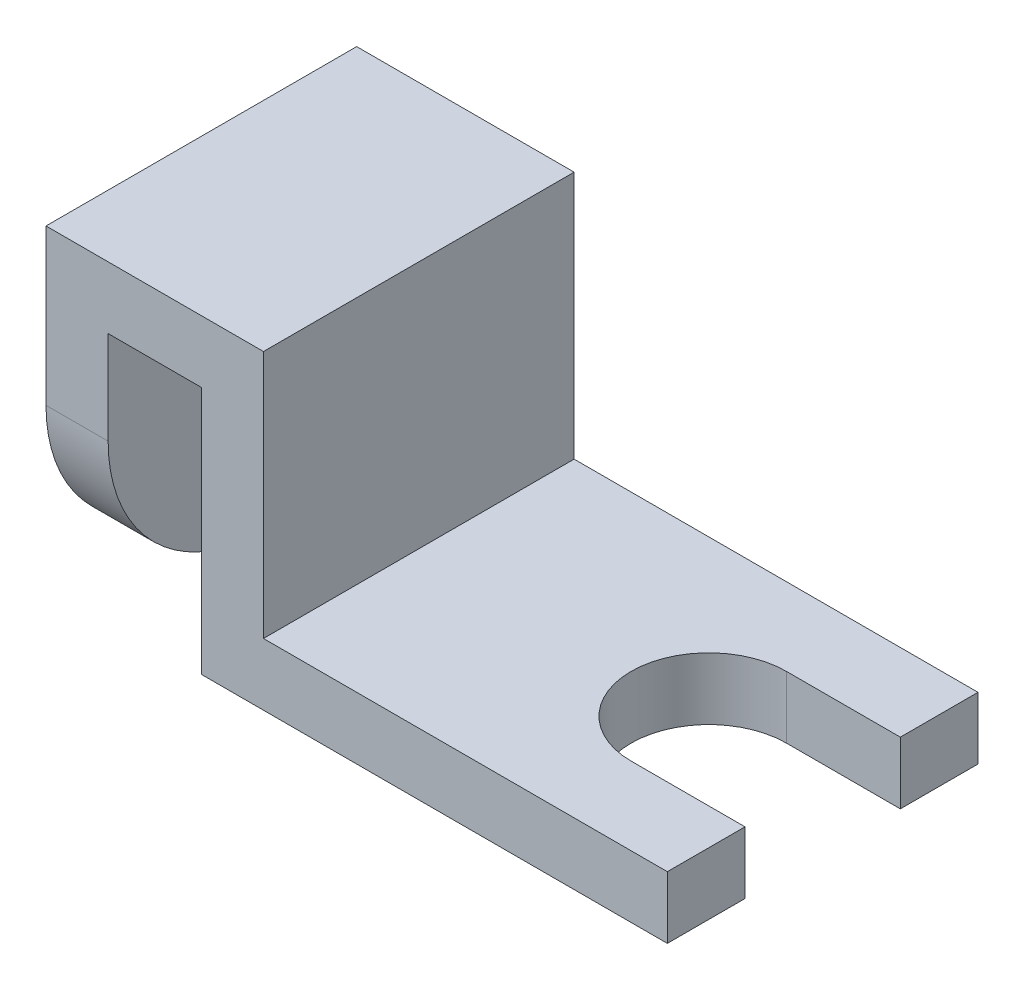
ISO-10303-21;
HEADER;
FILE_DESCRIPTION(('STEP AP214'),'2;1');
FILE_NAME('part.step','',(''),(''),'','','');
FILE_SCHEMA(('AUTOMOTIVE_DESIGN { 1 0 10303 214 1 1 1 1 }'));
ENDSEC;
DATA;
#1=APPLICATION_CONTEXT('core data for automotive mechanical design processes');
#2=APPLICATION_PROTOCOL_DEFINITION('international standard','automotive_design',2000,#1);
#3=PRODUCT_CONTEXT('',#1,'mechanical');
#4=PRODUCT('Part','Part','',(#3));
#5=PRODUCT_RELATED_PRODUCT_CATEGORY('part','',(#4));
#6=PRODUCT_DEFINITION_FORMATION('','',#4);
#7=PRODUCT_DEFINITION_CONTEXT('part definition',#1,'design');
#8=PRODUCT_DEFINITION('design','',#6,#7);
#9=PRODUCT_DEFINITION_SHAPE('','',#8);
#10=(LENGTH_UNIT() NAMED_UNIT(*) SI_UNIT(.MILLI.,.METRE.));
#11=(NAMED_UNIT(*) PLANE_ANGLE_UNIT() SI_UNIT($,.RADIAN.));
#12=(NAMED_UNIT(*) SI_UNIT($,.STERADIAN.) SOLID_ANGLE_UNIT());
#13=UNCERTAINTY_MEASURE_WITH_UNIT(LENGTH_MEASURE(1.E-05),#10,'distance_accuracy_value','');
#14=(GEOMETRIC_REPRESENTATION_CONTEXT(3) GLOBAL_UNCERTAINTY_ASSIGNED_CONTEXT((#13)) GLOBAL_UNIT_ASSIGNED_CONTEXT((#10,
#11,#12)) REPRESENTATION_CONTEXT('',''));
#15=CARTESIAN_POINT('',(0.,0.,0.));
#16=DIRECTION('',(0.,0.,1.));
#17=DIRECTION('',(1.,0.,0.));
#18=AXIS2_PLACEMENT_3D('',#15,#16,#17);
#19=CARTESIAN_POINT('',(0.,-3.,30.));
#20=DIRECTION('',(0.,1.,0.));
#21=DIRECTION('',(0.,0.,1.));
#22=AXIS2_PLACEMENT_3D('',#19,#20,#21);
#23=PLANE('',#22);
#24=DIRECTION('',(1.,0.,0.));
#25=VECTOR('',#24,1.);
#26=CARTESIAN_POINT('',(0.,-3.,7.50000000000001));
#27=LINE('',#26,#25);
#28=CARTESIAN_POINT('',(11.5,-3.,7.50000000000001));
#29=VERTEX_POINT('',#28);
#30=CARTESIAN_POINT('',(22.5,-3.,7.50000000000001));
#31=VERTEX_POINT('',#30);
#32=EDGE_CURVE('E157',#29,#31,#27,.T.);
#33=ORIENTED_EDGE('',*,*,#32,.F.);
#34=CARTESIAN_POINT('',(11.5,-3.,15.));
#35=DIRECTION('',(0.,1.,0.));
#36=DIRECTION('',(0.,0.,1.));
#37=AXIS2_PLACEMENT_3D('',#34,#35,#36);
#38=CIRCLE('',#37,7.5);
#39=CARTESIAN_POINT('',(11.5,-3.,22.5));
#40=VERTEX_POINT('',#39);
#41=EDGE_CURVE('E167',#29,#40,#38,.T.);
#42=ORIENTED_EDGE('',*,*,#41,.T.);
#43=DIRECTION('',(-1.,0.,0.));
#44=VECTOR('',#43,1.);
#45=CARTESIAN_POINT('',(0.,-3.,22.5));
#46=LINE('',#45,#44);
#47=CARTESIAN_POINT('',(22.5,-3.,22.5));
#48=VERTEX_POINT('',#47);
#49=EDGE_CURVE('E163',#48,#40,#46,.T.);
#50=ORIENTED_EDGE('',*,*,#49,.F.);
#51=DIRECTION('',(0.,0.,-1.));
#52=VECTOR('',#51,1.);
#53=CARTESIAN_POINT('',(22.5,-3.,30.));
#54=LINE('',#53,#52);
#55=CARTESIAN_POINT('',(22.5,-3.,30.));
#56=VERTEX_POINT('',#55);
#57=EDGE_CURVE('E254',#56,#48,#54,.T.);
#58=ORIENTED_EDGE('',*,*,#57,.F.);
#59=DIRECTION('',(1.,0.,0.));
#60=VECTOR('',#59,1.);
#61=CARTESIAN_POINT('',(0.,-3.,30.));
#62=LINE('',#61,#60);
#63=CARTESIAN_POINT('',(-22.5,-3.,30.));
#64=VERTEX_POINT('',#63);
#65=EDGE_CURVE('E206',#64,#56,#62,.T.);
#66=ORIENTED_EDGE('',*,*,#65,.F.);
#67=DIRECTION('',(0.,0.,-1.));
#68=VECTOR('',#67,1.);
#69=CARTESIAN_POINT('',(-22.5,-3.,30.));
#70=LINE('',#69,#68);
#71=CARTESIAN_POINT('',(-22.5,-3.,0.));
#72=VERTEX_POINT('',#71);
#73=EDGE_CURVE('E257',#64,#72,#70,.T.);
#74=ORIENTED_EDGE('',*,*,#73,.T.);
#75=DIRECTION('',(1.,0.,0.));
#76=VECTOR('',#75,1.);
#77=CARTESIAN_POINT('',(0.,-3.,0.));
#78=LINE('',#77,#76);
#79=CARTESIAN_POINT('',(22.5,-3.,0.));
#80=VERTEX_POINT('',#79);
#81=EDGE_CURVE('E229',#72,#80,#78,.T.);
#82=ORIENTED_EDGE('',*,*,#81,.T.);
#83=EDGE_CURVE('E174',#31,#80,#54,.T.);
#84=ORIENTED_EDGE('',*,*,#83,.F.);
#85=EDGE_LOOP('',(#33,#42,#50,#58,#66,#74,#82,#84));
#86=FACE_BOUND('',#85,.T.);
#87=ADVANCED_FACE('F48',(#86),#23,.F.);
#88=CARTESIAN_POINT('',(22.5,0.,30.));
#89=DIRECTION('',(-1.,0.,0.));
#90=DIRECTION('',(0.,0.,1.));
#91=AXIS2_PLACEMENT_3D('',#88,#89,#90);
#92=PLANE('',#91);
#93=DIRECTION('',(0.,1.,0.));
#94=VECTOR('',#93,1.);
#95=CARTESIAN_POINT('',(22.5,-3.,7.50000000000001));
#96=LINE('',#95,#94);
#97=CARTESIAN_POINT('',(22.5,3.,7.50000000000001));
#98=VERTEX_POINT('',#97);
#99=EDGE_CURVE('E184',#31,#98,#96,.T.);
#100=ORIENTED_EDGE('',*,*,#99,.F.);
#101=ORIENTED_EDGE('',*,*,#83,.T.);
#102=DIRECTION('',(0.,1.,0.));
#103=VECTOR('',#102,1.);
#104=CARTESIAN_POINT('',(22.5,0.,0.));
#105=LINE('',#104,#103);
#106=CARTESIAN_POINT('',(22.5,3.,0.));
#107=VERTEX_POINT('',#106);
#108=EDGE_CURVE('E231',#80,#107,#105,.T.);
#109=ORIENTED_EDGE('',*,*,#108,.T.);
#110=DIRECTION('',(0.,0.,-1.));
#111=VECTOR('',#110,1.);
#112=CARTESIAN_POINT('',(22.5,3.,30.));
#113=LINE('',#112,#111);
#114=EDGE_CURVE('E250',#98,#107,#113,.T.);
#115=ORIENTED_EDGE('',*,*,#114,.F.);
#116=EDGE_LOOP('',(#100,#101,#109,#115));
#117=FACE_BOUND('',#116,.T.);
#118=ADVANCED_FACE('F314',(#117),#92,.F.);
#119=DIRECTION('',(0.,1.,0.));
#120=VECTOR('',#119,1.);
#121=CARTESIAN_POINT('',(22.5,-3.,22.5));
#122=LINE('',#121,#120);
#123=CARTESIAN_POINT('',(22.5,3.,22.5));
#124=VERTEX_POINT('',#123);
#125=EDGE_CURVE('E187',#48,#124,#122,.T.);
#126=ORIENTED_EDGE('',*,*,#125,.T.);
#127=CARTESIAN_POINT('',(22.5,3.,30.));
#128=VERTEX_POINT('',#127);
#129=EDGE_CURVE('E251',#128,#124,#113,.T.);
#130=ORIENTED_EDGE('',*,*,#129,.F.);
#131=DIRECTION('',(0.,1.,0.));
#132=VECTOR('',#131,1.);
#133=CARTESIAN_POINT('',(22.5,0.,30.));
#134=LINE('',#133,#132);
#135=EDGE_CURVE('E208',#56,#128,#134,.T.);
#136=ORIENTED_EDGE('',*,*,#135,.F.);
#137=ORIENTED_EDGE('',*,*,#57,.T.);
#138=EDGE_LOOP('',(#126,#130,#136,#137));
#139=FACE_BOUND('',#138,.T.);
#140=ADVANCED_FACE('F322',(#139),#92,.F.);
#141=CARTESIAN_POINT('',(0.,3.,30.));
#142=DIRECTION('',(0.,1.,0.));
#143=DIRECTION('',(0.,0.,1.));
#144=AXIS2_PLACEMENT_3D('',#141,#142,#143);
#145=PLANE('',#144);
#146=CARTESIAN_POINT('',(11.5,3.,15.));
#147=DIRECTION('',(0.,1.,0.));
#148=DIRECTION('',(0.,0.,1.));
#149=AXIS2_PLACEMENT_3D('',#146,#147,#148);
#150=CIRCLE('',#149,7.5);
#151=CARTESIAN_POINT('',(11.5,3.,7.50000000000001));
#152=VERTEX_POINT('',#151);
#153=CARTESIAN_POINT('',(11.5,3.,22.5));
#154=VERTEX_POINT('',#153);
#155=EDGE_CURVE('E178',#152,#154,#150,.T.);
#156=ORIENTED_EDGE('',*,*,#155,.F.);
#157=DIRECTION('',(1.,0.,0.));
#158=VECTOR('',#157,1.);
#159=CARTESIAN_POINT('',(0.,3.,7.50000000000001));
#160=LINE('',#159,#158);
#161=EDGE_CURVE('E64',#152,#98,#160,.T.);
#162=ORIENTED_EDGE('',*,*,#161,.T.);
#163=ORIENTED_EDGE('',*,*,#114,.T.);
#164=DIRECTION('',(1.,0.,0.));
#165=VECTOR('',#164,1.);
#166=CARTESIAN_POINT('',(0.,3.,0.));
#167=LINE('',#166,#165);
#168=CARTESIAN_POINT('',(-16.5,3.,0.));
#169=VERTEX_POINT('',#168);
#170=EDGE_CURVE('E234',#169,#107,#167,.T.);
#171=ORIENTED_EDGE('',*,*,#170,.F.);
#172=DIRECTION('',(0.,0.,-1.));
#173=VECTOR('',#172,1.);
#174=CARTESIAN_POINT('',(-16.5,3.,30.));
#175=LINE('',#174,#173);
#176=CARTESIAN_POINT('',(-16.5,3.,30.));
#177=VERTEX_POINT('',#176);
#178=EDGE_CURVE('E248',#177,#169,#175,.T.);
#179=ORIENTED_EDGE('',*,*,#178,.F.);
#180=DIRECTION('',(1.,0.,0.));
#181=VECTOR('',#180,1.);
#182=CARTESIAN_POINT('',(0.,3.,30.));
#183=LINE('',#182,#181);
#184=EDGE_CURVE('E210',#177,#128,#183,.T.);
#185=ORIENTED_EDGE('',*,*,#184,.T.);
#186=ORIENTED_EDGE('',*,*,#129,.T.);
#187=DIRECTION('',(-1.,0.,0.));
#188=VECTOR('',#187,1.);
#189=CARTESIAN_POINT('',(0.,3.,22.5));
#190=LINE('',#189,#188);
#191=EDGE_CURVE('E175',#124,#154,#190,.T.);
#192=ORIENTED_EDGE('',*,*,#191,.T.);
#193=EDGE_LOOP('',(#156,#162,#163,#171,#179,#185,#186,#192));
#194=FACE_BOUND('',#193,.T.);
#195=ADVANCED_FACE('F310',(#194),#145,.T.);
#196=CARTESIAN_POINT('',(-31.5,0.,30.));
#197=DIRECTION('',(1.,0.,0.));
#198=DIRECTION('',(0.,0.,-1.));
#199=AXIS2_PLACEMENT_3D('',#196,#197,#198);
#200=PLANE('',#199);
#201=CARTESIAN_POINT('',(-31.5,12.,15.));
#202=DIRECTION('',(1.,0.,0.));
#203=DIRECTION('',(0.,0.,-1.));
#204=AXIS2_PLACEMENT_3D('',#201,#202,#203);
#205=CIRCLE('',#204,6.);
#206=CARTESIAN_POINT('',(-31.5,12.,9.00000000000001));
#207=VERTEX_POINT('',#206);
#208=EDGE_CURVE('E186',#207,#207,#205,.F.);
#209=ORIENTED_EDGE('',*,*,#208,.T.);
#210=EDGE_LOOP('',(#209));
#211=FACE_BOUND('',#210,.T.);
#212=CARTESIAN_POINT('',(-31.5,12.,15.));
#213=DIRECTION('',(1.,0.,0.));
#214=DIRECTION('',(0.,0.,-1.));
#215=AXIS2_PLACEMENT_3D('',#212,#213,#214);
#216=CIRCLE('',#215,15.);
#217=CARTESIAN_POINT('',(-31.5,12.,30.));
#218=VERTEX_POINT('',#217);
#219=CARTESIAN_POINT('',(-31.5,-3.,15.));
#220=VERTEX_POINT('',#219);
#221=EDGE_CURVE('E263',#218,#220,#216,.T.);
#222=ORIENTED_EDGE('',*,*,#221,.T.);
#223=CARTESIAN_POINT('',(-31.5,12.,15.));
#224=DIRECTION('',(1.,0.,0.));
#225=DIRECTION('',(0.,0.,-1.));
#226=AXIS2_PLACEMENT_3D('',#223,#224,#225);
#227=CIRCLE('',#226,15.);
#228=CARTESIAN_POINT('',(-31.5,12.,0.));
#229=VERTEX_POINT('',#228);
#230=EDGE_CURVE('E265',#220,#229,#227,.T.);
#231=ORIENTED_EDGE('',*,*,#230,.T.);
#232=DIRECTION('',(0.,-1.,0.));
#233=VECTOR('',#232,1.);
#234=CARTESIAN_POINT('',(-31.5,0.,0.));
#235=LINE('',#234,#233);
#236=CARTESIAN_POINT('',(-31.5,21.,0.));
#237=VERTEX_POINT('',#236);
#238=EDGE_CURVE('E220',#237,#229,#235,.T.);
#239=ORIENTED_EDGE('',*,*,#238,.F.);
#240=DIRECTION('',(0.,0.,-1.));
#241=VECTOR('',#240,1.);
#242=CARTESIAN_POINT('',(-31.5,21.,30.));
#243=LINE('',#242,#241);
#244=CARTESIAN_POINT('',(-31.5,21.,30.));
#245=VERTEX_POINT('',#244);
#246=EDGE_CURVE('E261',#245,#237,#243,.T.);
#247=ORIENTED_EDGE('',*,*,#246,.F.);
#248=DIRECTION('',(0.,-1.,0.));
#249=VECTOR('',#248,1.);
#250=CARTESIAN_POINT('',(-31.5,0.,30.));
#251=LINE('',#250,#249);
#252=EDGE_CURVE('E196',#245,#218,#251,.T.);
#253=ORIENTED_EDGE('',*,*,#252,.T.);
#254=EDGE_LOOP('',(#222,#231,#239,#247,#253));
#255=FACE_BOUND('',#254,.T.);
#256=ADVANCED_FACE('F284',(#211,#255),#200,.T.);
#257=CARTESIAN_POINT('',(0.,21.,30.));
#258=DIRECTION('',(0.,-1.,0.));
#259=DIRECTION('',(0.,0.,-1.));
#260=AXIS2_PLACEMENT_3D('',#257,#258,#259);
#261=PLANE('',#260);
#262=DIRECTION('',(-1.,0.,0.));
#263=VECTOR('',#262,1.);
#264=CARTESIAN_POINT('',(0.,21.,0.));
#265=LINE('',#264,#263);
#266=CARTESIAN_POINT('',(-22.5,21.,0.));
#267=VERTEX_POINT('',#266);
#268=EDGE_CURVE('E223',#267,#237,#265,.T.);
#269=ORIENTED_EDGE('',*,*,#268,.F.);
#270=DIRECTION('',(0.,0.,-1.));
#271=VECTOR('',#270,1.);
#272=CARTESIAN_POINT('',(-22.5,21.,30.));
#273=LINE('',#272,#271);
#274=CARTESIAN_POINT('',(-22.5,21.,30.));
#275=VERTEX_POINT('',#274);
#276=EDGE_CURVE('E259',#275,#267,#273,.T.);
#277=ORIENTED_EDGE('',*,*,#276,.F.);
#278=DIRECTION('',(-1.,0.,0.));
#279=VECTOR('',#278,1.);
#280=CARTESIAN_POINT('',(0.,21.,30.));
#281=LINE('',#280,#279);
#282=EDGE_CURVE('E199',#275,#245,#281,.T.);
#283=ORIENTED_EDGE('',*,*,#282,.T.);
#284=ORIENTED_EDGE('',*,*,#246,.T.);
#285=EDGE_LOOP('',(#269,#277,#283,#284));
#286=FACE_BOUND('',#285,.T.);
#287=ADVANCED_FACE('F291',(#286),#261,.T.);
#288=CARTESIAN_POINT('',(-22.5,0.,30.));
#289=DIRECTION('',(-1.,0.,0.));
#290=DIRECTION('',(0.,0.,1.));
#291=AXIS2_PLACEMENT_3D('',#288,#289,#290);
#292=PLANE('',#291);
#293=DIRECTION('',(0.,1.,0.));
#294=VECTOR('',#293,1.);
#295=CARTESIAN_POINT('',(-22.5,0.,0.));
#296=LINE('',#295,#294);
#297=EDGE_CURVE('E226',#72,#267,#296,.T.);
#298=ORIENTED_EDGE('',*,*,#297,.F.);
#299=ORIENTED_EDGE('',*,*,#73,.F.);
#300=DIRECTION('',(0.,1.,0.));
#301=VECTOR('',#300,1.);
#302=CARTESIAN_POINT('',(-22.5,0.,30.));
#303=LINE('',#302,#301);
#304=EDGE_CURVE('E203',#64,#275,#303,.T.);
#305=ORIENTED_EDGE('',*,*,#304,.T.);
#306=ORIENTED_EDGE('',*,*,#276,.T.);
#307=EDGE_LOOP('',(#298,#299,#305,#306));
#308=FACE_BOUND('',#307,.T.);
#309=ADVANCED_FACE('F318',(#308),#292,.T.);
#310=CARTESIAN_POINT('',(-16.5,0.,30.));
#311=DIRECTION('',(-1.,0.,0.));
#312=DIRECTION('',(0.,0.,1.));
#313=AXIS2_PLACEMENT_3D('',#310,#311,#312);
#314=PLANE('',#313);
#315=DIRECTION('',(0.,1.,0.));
#316=VECTOR('',#315,1.);
#317=CARTESIAN_POINT('',(-16.5,0.,0.));
#318=LINE('',#317,#316);
#319=CARTESIAN_POINT('',(-16.5,27.,0.));
#320=VERTEX_POINT('',#319);
#321=EDGE_CURVE('E237',#169,#320,#318,.T.);
#322=ORIENTED_EDGE('',*,*,#321,.T.);
#323=DIRECTION('',(0.,0.,-1.));
#324=VECTOR('',#323,1.);
#325=CARTESIAN_POINT('',(-16.5,27.,30.));
#326=LINE('',#325,#324);
#327=CARTESIAN_POINT('',(-16.5,27.,30.));
#328=VERTEX_POINT('',#327);
#329=EDGE_CURVE('E245',#328,#320,#326,.T.);
#330=ORIENTED_EDGE('',*,*,#329,.F.);
#331=DIRECTION('',(0.,1.,0.));
#332=VECTOR('',#331,1.);
#333=CARTESIAN_POINT('',(-16.5,0.,30.));
#334=LINE('',#333,#332);
#335=EDGE_CURVE('E213',#177,#328,#334,.T.);
#336=ORIENTED_EDGE('',*,*,#335,.F.);
#337=ORIENTED_EDGE('',*,*,#178,.T.);
#338=EDGE_LOOP('',(#322,#330,#336,#337));
#339=FACE_BOUND('',#338,.T.);
#340=ADVANCED_FACE('F307',(#339),#314,.F.);
#341=CARTESIAN_POINT('',(0.,27.,30.));
#342=DIRECTION('',(0.,-1.,0.));
#343=DIRECTION('',(1.,0.,0.));
#344=AXIS2_PLACEMENT_3D('',#341,#342,#343);
#345=PLANE('',#344);
#346=DIRECTION('',(-1.,0.,0.));
#347=VECTOR('',#346,1.);
#348=CARTESIAN_POINT('',(0.,27.,0.));
#349=LINE('',#348,#347);
#350=CARTESIAN_POINT('',(-37.5,27.,0.));
#351=VERTEX_POINT('',#350);
#352=EDGE_CURVE('E239',#320,#351,#349,.T.);
#353=ORIENTED_EDGE('',*,*,#352,.T.);
#354=DIRECTION('',(0.,0.,-1.));
#355=VECTOR('',#354,1.);
#356=CARTESIAN_POINT('',(-37.5,27.,30.));
#357=LINE('',#356,#355);
#358=CARTESIAN_POINT('',(-37.5,27.,30.));
#359=VERTEX_POINT('',#358);
#360=EDGE_CURVE('E219',#359,#351,#357,.T.);
#361=ORIENTED_EDGE('',*,*,#360,.F.);
#362=DIRECTION('',(-1.,0.,0.));
#363=VECTOR('',#362,1.);
#364=CARTESIAN_POINT('',(0.,27.,30.));
#365=LINE('',#364,#363);
#366=EDGE_CURVE('E215',#328,#359,#365,.T.);
#367=ORIENTED_EDGE('',*,*,#366,.F.);
#368=ORIENTED_EDGE('',*,*,#329,.T.);
#369=EDGE_LOOP('',(#353,#361,#367,#368));
#370=FACE_BOUND('',#369,.T.);
#371=ADVANCED_FACE('F303',(#370),#345,.F.);
#372=CARTESIAN_POINT('',(-37.5,0.,30.));
#373=DIRECTION('',(1.,0.,0.));
#374=DIRECTION('',(0.,0.,-1.));
#375=AXIS2_PLACEMENT_3D('',#372,#373,#374);
#376=PLANE('',#375);
#377=CARTESIAN_POINT('',(-37.5,12.,15.));
#378=DIRECTION('',(-1.,0.,0.));
#379=DIRECTION('',(0.,0.,1.));
#380=AXIS2_PLACEMENT_3D('',#377,#378,#379);
#381=CIRCLE('',#380,6.);
#382=CARTESIAN_POINT('',(-37.5,12.,21.));
#383=VERTEX_POINT('',#382);
#384=EDGE_CURVE('E193',#383,#383,#381,.T.);
#385=ORIENTED_EDGE('',*,*,#384,.F.);
#386=EDGE_LOOP('',(#385));
#387=FACE_BOUND('',#386,.T.);
#388=DIRECTION('',(0.,-1.,0.));
#389=VECTOR('',#388,1.);
#390=CARTESIAN_POINT('',(-37.5,0.,0.));
#391=LINE('',#390,#389);
#392=CARTESIAN_POINT('',(-37.5,12.,0.));
#393=VERTEX_POINT('',#392);
#394=EDGE_CURVE('E200',#351,#393,#391,.T.);
#395=ORIENTED_EDGE('',*,*,#394,.T.);
#396=CARTESIAN_POINT('',(-37.5,12.,15.));
#397=DIRECTION('',(1.,0.,0.));
#398=DIRECTION('',(0.,0.,-1.));
#399=AXIS2_PLACEMENT_3D('',#396,#397,#398);
#400=CIRCLE('',#399,15.);
#401=CARTESIAN_POINT('',(-37.5,-3.,15.));
#402=VERTEX_POINT('',#401);
#403=EDGE_CURVE('E57',#393,#402,#400,.F.);
#404=ORIENTED_EDGE('',*,*,#403,.T.);
#405=CARTESIAN_POINT('',(-37.5,12.,15.));
#406=DIRECTION('',(1.,0.,0.));
#407=DIRECTION('',(0.,0.,-1.));
#408=AXIS2_PLACEMENT_3D('',#405,#406,#407);
#409=CIRCLE('',#408,15.);
#410=CARTESIAN_POINT('',(-37.5,12.,30.));
#411=VERTEX_POINT('',#410);
#412=EDGE_CURVE('E72',#402,#411,#409,.F.);
#413=ORIENTED_EDGE('',*,*,#412,.T.);
#414=DIRECTION('',(0.,-1.,0.));
#415=VECTOR('',#414,1.);
#416=CARTESIAN_POINT('',(-37.5,0.,30.));
#417=LINE('',#416,#415);
#418=EDGE_CURVE('E217',#359,#411,#417,.T.);
#419=ORIENTED_EDGE('',*,*,#418,.F.);
#420=ORIENTED_EDGE('',*,*,#360,.T.);
#421=EDGE_LOOP('',(#395,#404,#413,#419,#420));
#422=FACE_BOUND('',#421,.T.);
#423=ADVANCED_FACE('F271',(#387,#422),#376,.F.);
#424=CARTESIAN_POINT('',(0.,0.,30.));
#425=DIRECTION('',(0.,0.,1.));
#426=DIRECTION('',(1.,0.,0.));
#427=AXIS2_PLACEMENT_3D('',#424,#425,#426);
#428=PLANE('',#427);
#429=ORIENTED_EDGE('',*,*,#418,.T.);
#430=DIRECTION('',(1.,0.,0.));
#431=VECTOR('',#430,1.);
#432=CARTESIAN_POINT('',(-31.5,12.,30.));
#433=LINE('',#432,#431);
#434=EDGE_CURVE('E13',#411,#218,#433,.T.);
#435=ORIENTED_EDGE('',*,*,#434,.T.);
#436=ORIENTED_EDGE('',*,*,#252,.F.);
#437=ORIENTED_EDGE('',*,*,#282,.F.);
#438=ORIENTED_EDGE('',*,*,#304,.F.);
#439=ORIENTED_EDGE('',*,*,#65,.T.);
#440=ORIENTED_EDGE('',*,*,#135,.T.);
#441=ORIENTED_EDGE('',*,*,#184,.F.);
#442=ORIENTED_EDGE('',*,*,#335,.T.);
#443=ORIENTED_EDGE('',*,*,#366,.T.);
#444=EDGE_LOOP('',(#429,#435,#436,#437,#438,#439,#440,#441,#442,#443));
#445=FACE_BOUND('',#444,.T.);
#446=ADVANCED_FACE('F295',(#445),#428,.T.);
#447=CARTESIAN_POINT('',(0.,0.,0.));
#448=DIRECTION('',(0.,0.,1.));
#449=DIRECTION('',(1.,0.,0.));
#450=AXIS2_PLACEMENT_3D('',#447,#448,#449);
#451=PLANE('',#450);
#452=ORIENTED_EDGE('',*,*,#238,.T.);
#453=DIRECTION('',(1.,0.,0.));
#454=VECTOR('',#453,1.);
#455=CARTESIAN_POINT('',(0.,12.,0.));
#456=LINE('',#455,#454);
#457=EDGE_CURVE('E267',#229,#393,#456,.F.);
#458=ORIENTED_EDGE('',*,*,#457,.T.);
#459=ORIENTED_EDGE('',*,*,#394,.F.);
#460=ORIENTED_EDGE('',*,*,#352,.F.);
#461=ORIENTED_EDGE('',*,*,#321,.F.);
#462=ORIENTED_EDGE('',*,*,#170,.T.);
#463=ORIENTED_EDGE('',*,*,#108,.F.);
#464=ORIENTED_EDGE('',*,*,#81,.F.);
#465=ORIENTED_EDGE('',*,*,#297,.T.);
#466=ORIENTED_EDGE('',*,*,#268,.T.);
#467=EDGE_LOOP('',(#452,#458,#459,#460,#461,#462,#463,#464,#465,#466));
#468=FACE_BOUND('',#467,.T.);
#469=ADVANCED_FACE('F286',(#468),#451,.F.);
#470=CARTESIAN_POINT('',(0.,12.,15.));
#471=DIRECTION('',(-1.,0.,0.));
#472=DIRECTION('',(0.,-1.,0.));
#473=AXIS2_PLACEMENT_3D('',#470,#471,#472);
#474=CYLINDRICAL_SURFACE('',#473,15.);
#475=ORIENTED_EDGE('',*,*,#434,.F.);
#476=ORIENTED_EDGE('',*,*,#412,.F.);
#477=DIRECTION('',(1.,0.,0.));
#478=VECTOR('',#477,1.);
#479=CARTESIAN_POINT('',(-37.5,-3.,15.));
#480=LINE('',#479,#478);
#481=EDGE_CURVE('E52',#220,#402,#480,.F.);
#482=ORIENTED_EDGE('',*,*,#481,.F.);
#483=ORIENTED_EDGE('',*,*,#221,.F.);
#484=EDGE_LOOP('',(#475,#476,#482,#483));
#485=FACE_BOUND('',#484,.T.);
#486=ADVANCED_FACE('F50',(#485),#474,.T.);
#487=CARTESIAN_POINT('',(0.,12.,15.));
#488=DIRECTION('',(1.,0.,0.));
#489=DIRECTION('',(0.,1.,0.));
#490=AXIS2_PLACEMENT_3D('',#487,#488,#489);
#491=CYLINDRICAL_SURFACE('',#490,15.);
#492=ORIENTED_EDGE('',*,*,#403,.F.);
#493=ORIENTED_EDGE('',*,*,#457,.F.);
#494=ORIENTED_EDGE('',*,*,#230,.F.);
#495=ORIENTED_EDGE('',*,*,#481,.T.);
#496=EDGE_LOOP('',(#492,#493,#494,#495));
#497=FACE_BOUND('',#496,.T.);
#498=ADVANCED_FACE('F281',(#497),#491,.T.);
#499=CARTESIAN_POINT('',(22.501,12.,15.));
#500=DIRECTION('',(-1.,0.,0.));
#501=DIRECTION('',(0.,0.,1.));
#502=AXIS2_PLACEMENT_3D('',#499,#500,#501);
#503=CYLINDRICAL_SURFACE('',#502,6.);
#504=ORIENTED_EDGE('',*,*,#208,.F.);
#505=EDGE_LOOP('',(#504));
#506=FACE_BOUND('',#505,.T.);
#507=ORIENTED_EDGE('',*,*,#384,.T.);
#508=EDGE_LOOP('',(#507));
#509=FACE_BOUND('',#508,.T.);
#510=ADVANCED_FACE('F332',(#506,#509),#503,.F.);
#511=CARTESIAN_POINT('',(0.,-3.,7.50000000000001));
#512=DIRECTION('',(0.,0.,1.));
#513=DIRECTION('',(1.,0.,0.));
#514=AXIS2_PLACEMENT_3D('',#511,#512,#513);
#515=PLANE('',#514);
#516=ORIENTED_EDGE('',*,*,#161,.F.);
#517=DIRECTION('',(0.,1.,0.));
#518=VECTOR('',#517,1.);
#519=CARTESIAN_POINT('',(11.5,-3.,7.50000000000001));
#520=LINE('',#519,#518);
#521=EDGE_CURVE('E153',#29,#152,#520,.T.);
#522=ORIENTED_EDGE('',*,*,#521,.F.);
#523=ORIENTED_EDGE('',*,*,#32,.T.);
#524=ORIENTED_EDGE('',*,*,#99,.T.);
#525=EDGE_LOOP('',(#516,#522,#523,#524));
#526=FACE_BOUND('',#525,.T.);
#527=ADVANCED_FACE('F155',(#526),#515,.T.);
#528=CARTESIAN_POINT('',(0.,-3.,22.5));
#529=DIRECTION('',(0.,0.,-1.));
#530=DIRECTION('',(-1.,0.,0.));
#531=AXIS2_PLACEMENT_3D('',#528,#529,#530);
#532=PLANE('',#531);
#533=ORIENTED_EDGE('',*,*,#191,.F.);
#534=ORIENTED_EDGE('',*,*,#125,.F.);
#535=ORIENTED_EDGE('',*,*,#49,.T.);
#536=DIRECTION('',(0.,1.,0.));
#537=VECTOR('',#536,1.);
#538=CARTESIAN_POINT('',(11.5,-3.,22.5));
#539=LINE('',#538,#537);
#540=EDGE_CURVE('E162',#40,#154,#539,.T.);
#541=ORIENTED_EDGE('',*,*,#540,.T.);
#542=EDGE_LOOP('',(#533,#534,#535,#541));
#543=FACE_BOUND('',#542,.T.);
#544=ADVANCED_FACE('F324',(#543),#532,.T.);
#545=CARTESIAN_POINT('',(11.5,-3.,15.));
#546=DIRECTION('',(0.,1.,0.));
#547=DIRECTION('',(0.,0.,1.));
#548=AXIS2_PLACEMENT_3D('',#545,#546,#547);
#549=CYLINDRICAL_SURFACE('',#548,7.5);
#550=ORIENTED_EDGE('',*,*,#155,.T.);
#551=ORIENTED_EDGE('',*,*,#540,.F.);
#552=ORIENTED_EDGE('',*,*,#41,.F.);
#553=ORIENTED_EDGE('',*,*,#521,.T.);
#554=EDGE_LOOP('',(#550,#551,#552,#553));
#555=FACE_BOUND('',#554,.T.);
#556=ADVANCED_FACE('F168',(#555),#549,.F.);
#557=CLOSED_SHELL('',(#87,#118,#140,#195,#256,#287,#309,#340,#371,#423,#446,#469,#486,#498,#510,
#527,#544,#556));
#558=MANIFOLD_SOLID_BREP('B2',#557);
#559=ADVANCED_BREP_SHAPE_REPRESENTATION('',(#18,#558),#14);
#560=SHAPE_DEFINITION_REPRESENTATION(#9,#559);
ENDSEC;
END-ISO-10303-21;
